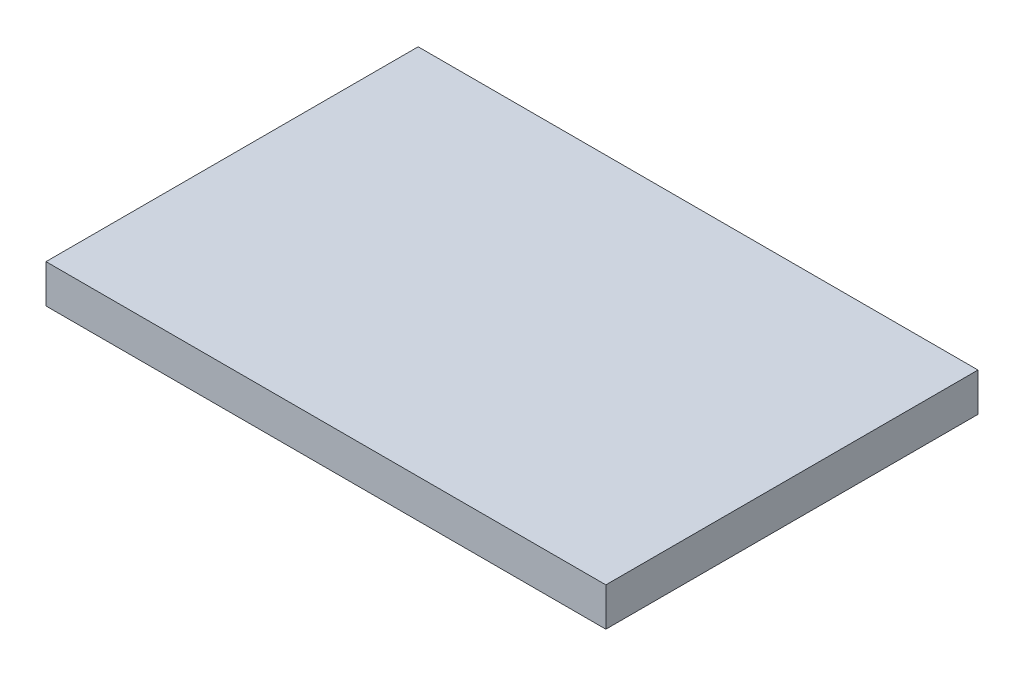
ISO-10303-21;
HEADER;
FILE_DESCRIPTION(('STEP AP214'),'2;1');
FILE_NAME('part.step','',(''),(''),'','','');
FILE_SCHEMA(('AUTOMOTIVE_DESIGN { 1 0 10303 214 1 1 1 1 }'));
ENDSEC;
DATA;
#1=APPLICATION_CONTEXT('core data for automotive mechanical design processes');
#2=APPLICATION_PROTOCOL_DEFINITION('international standard','automotive_design',2000,#1);
#3=PRODUCT_CONTEXT('',#1,'mechanical');
#4=PRODUCT('Part','Part','',(#3));
#5=PRODUCT_RELATED_PRODUCT_CATEGORY('part','',(#4));
#6=PRODUCT_DEFINITION_FORMATION('','',#4);
#7=PRODUCT_DEFINITION_CONTEXT('part definition',#1,'design');
#8=PRODUCT_DEFINITION('design','',#6,#7);
#9=PRODUCT_DEFINITION_SHAPE('','',#8);
#10=(LENGTH_UNIT() NAMED_UNIT(*) SI_UNIT(.MILLI.,.METRE.));
#11=(NAMED_UNIT(*) PLANE_ANGLE_UNIT() SI_UNIT($,.RADIAN.));
#12=(NAMED_UNIT(*) SI_UNIT($,.STERADIAN.) SOLID_ANGLE_UNIT());
#13=UNCERTAINTY_MEASURE_WITH_UNIT(LENGTH_MEASURE(1.E-05),#10,'distance_accuracy_value','');
#14=(GEOMETRIC_REPRESENTATION_CONTEXT(3) GLOBAL_UNCERTAINTY_ASSIGNED_CONTEXT((#13)) GLOBAL_UNIT_ASSIGNED_CONTEXT((#10,
#11,#12)) REPRESENTATION_CONTEXT('',''));
#15=CARTESIAN_POINT('',(0.,0.,0.));
#16=DIRECTION('',(0.,0.,1.));
#17=DIRECTION('',(1.,0.,0.));
#18=AXIS2_PLACEMENT_3D('',#15,#16,#17);
#19=CARTESIAN_POINT('',(-25.5,3.5,16.95));
#20=DIRECTION('',(1.,0.,0.));
#21=DIRECTION('',(0.,0.,-1.));
#22=AXIS2_PLACEMENT_3D('',#19,#20,#21);
#23=PLANE('',#22);
#24=DIRECTION('',(0.,0.,1.));
#25=VECTOR('',#24,1.);
#26=CARTESIAN_POINT('',(-25.5,0.,16.95));
#27=LINE('',#26,#25);
#28=CARTESIAN_POINT('',(-25.5,0.,-16.95));
#29=VERTEX_POINT('',#28);
#30=CARTESIAN_POINT('',(-25.5,0.,16.95));
#31=VERTEX_POINT('',#30);
#32=EDGE_CURVE('E102',#29,#31,#27,.T.);
#33=ORIENTED_EDGE('',*,*,#32,.T.);
#34=DIRECTION('',(0.,-1.,0.));
#35=VECTOR('',#34,1.);
#36=CARTESIAN_POINT('',(-25.5,3.5,16.95));
#37=LINE('',#36,#35);
#38=CARTESIAN_POINT('',(-25.5,3.5,16.95));
#39=VERTEX_POINT('',#38);
#40=EDGE_CURVE('E11',#39,#31,#37,.T.);
#41=ORIENTED_EDGE('',*,*,#40,.F.);
#42=DIRECTION('',(0.,0.,1.));
#43=VECTOR('',#42,1.);
#44=CARTESIAN_POINT('',(-25.5,3.5,16.95));
#45=LINE('',#44,#43);
#46=CARTESIAN_POINT('',(-25.5,3.5,-16.95));
#47=VERTEX_POINT('',#46);
#48=EDGE_CURVE('E90',#47,#39,#45,.T.);
#49=ORIENTED_EDGE('',*,*,#48,.F.);
#50=DIRECTION('',(0.,-1.,0.));
#51=VECTOR('',#50,1.);
#52=CARTESIAN_POINT('',(-25.5,3.5,-16.95));
#53=LINE('',#52,#51);
#54=EDGE_CURVE('E98',#47,#29,#53,.T.);
#55=ORIENTED_EDGE('',*,*,#54,.T.);
#56=EDGE_LOOP('',(#33,#41,#49,#55));
#57=FACE_BOUND('',#56,.T.);
#58=ADVANCED_FACE('F39',(#57),#23,.F.);
#59=CARTESIAN_POINT('',(-25.5,3.5,16.95));
#60=DIRECTION('',(0.,0.,-1.));
#61=DIRECTION('',(-1.,0.,0.));
#62=AXIS2_PLACEMENT_3D('',#59,#60,#61);
#63=PLANE('',#62);
#64=DIRECTION('',(1.,0.,0.));
#65=VECTOR('',#64,1.);
#66=CARTESIAN_POINT('',(-25.5,0.,16.95));
#67=LINE('',#66,#65);
#68=CARTESIAN_POINT('',(25.5,0.,16.95));
#69=VERTEX_POINT('',#68);
#70=EDGE_CURVE('E94',#31,#69,#67,.T.);
#71=ORIENTED_EDGE('',*,*,#70,.T.);
#72=DIRECTION('',(0.,-1.,0.));
#73=VECTOR('',#72,1.);
#74=CARTESIAN_POINT('',(25.5,3.5,16.95));
#75=LINE('',#74,#73);
#76=CARTESIAN_POINT('',(25.5,3.5,16.95));
#77=VERTEX_POINT('',#76);
#78=EDGE_CURVE('E47',#77,#69,#75,.T.);
#79=ORIENTED_EDGE('',*,*,#78,.F.);
#80=DIRECTION('',(1.,0.,0.));
#81=VECTOR('',#80,1.);
#82=CARTESIAN_POINT('',(-25.5,3.5,16.95));
#83=LINE('',#82,#81);
#84=EDGE_CURVE('E85',#39,#77,#83,.T.);
#85=ORIENTED_EDGE('',*,*,#84,.F.);
#86=ORIENTED_EDGE('',*,*,#40,.T.);
#87=EDGE_LOOP('',(#71,#79,#85,#86));
#88=FACE_BOUND('',#87,.T.);
#89=ADVANCED_FACE('F93',(#88),#63,.F.);
#90=CARTESIAN_POINT('',(25.5,3.5,16.95));
#91=DIRECTION('',(-1.,0.,0.));
#92=DIRECTION('',(0.,0.,1.));
#93=AXIS2_PLACEMENT_3D('',#90,#91,#92);
#94=PLANE('',#93);
#95=DIRECTION('',(0.,0.,-1.));
#96=VECTOR('',#95,1.);
#97=CARTESIAN_POINT('',(25.5,0.,16.95));
#98=LINE('',#97,#96);
#99=CARTESIAN_POINT('',(25.5,0.,-16.95));
#100=VERTEX_POINT('',#99);
#101=EDGE_CURVE('E72',#69,#100,#98,.T.);
#102=ORIENTED_EDGE('',*,*,#101,.T.);
#103=DIRECTION('',(0.,-1.,0.));
#104=VECTOR('',#103,1.);
#105=CARTESIAN_POINT('',(25.5,3.5,-16.95));
#106=LINE('',#105,#104);
#107=CARTESIAN_POINT('',(25.5,3.5,-16.95));
#108=VERTEX_POINT('',#107);
#109=EDGE_CURVE('E95',#108,#100,#106,.T.);
#110=ORIENTED_EDGE('',*,*,#109,.F.);
#111=DIRECTION('',(0.,0.,-1.));
#112=VECTOR('',#111,1.);
#113=CARTESIAN_POINT('',(25.5,3.5,16.95));
#114=LINE('',#113,#112);
#115=EDGE_CURVE('E88',#77,#108,#114,.T.);
#116=ORIENTED_EDGE('',*,*,#115,.F.);
#117=ORIENTED_EDGE('',*,*,#78,.T.);
#118=EDGE_LOOP('',(#102,#110,#116,#117));
#119=FACE_BOUND('',#118,.T.);
#120=ADVANCED_FACE('F96',(#119),#94,.F.);
#121=CARTESIAN_POINT('',(-25.5,3.5,-16.95));
#122=DIRECTION('',(0.,0.,1.));
#123=DIRECTION('',(1.,0.,0.));
#124=AXIS2_PLACEMENT_3D('',#121,#122,#123);
#125=PLANE('',#124);
#126=DIRECTION('',(-1.,0.,0.));
#127=VECTOR('',#126,1.);
#128=CARTESIAN_POINT('',(-25.5,0.,-16.95));
#129=LINE('',#128,#127);
#130=EDGE_CURVE('E78',#100,#29,#129,.T.);
#131=ORIENTED_EDGE('',*,*,#130,.T.);
#132=ORIENTED_EDGE('',*,*,#54,.F.);
#133=DIRECTION('',(-1.,0.,0.));
#134=VECTOR('',#133,1.);
#135=CARTESIAN_POINT('',(-25.5,3.5,-16.95));
#136=LINE('',#135,#134);
#137=EDGE_CURVE('E55',#108,#47,#136,.T.);
#138=ORIENTED_EDGE('',*,*,#137,.F.);
#139=ORIENTED_EDGE('',*,*,#109,.T.);
#140=EDGE_LOOP('',(#131,#132,#138,#139));
#141=FACE_BOUND('',#140,.T.);
#142=ADVANCED_FACE('F109',(#141),#125,.F.);
#143=CARTESIAN_POINT('',(0.,3.5,0.));
#144=DIRECTION('',(0.,-1.,0.));
#145=DIRECTION('',(0.,0.,-1.));
#146=AXIS2_PLACEMENT_3D('',#143,#144,#145);
#147=PLANE('',#146);
#148=ORIENTED_EDGE('',*,*,#48,.T.);
#149=ORIENTED_EDGE('',*,*,#84,.T.);
#150=ORIENTED_EDGE('',*,*,#115,.T.);
#151=ORIENTED_EDGE('',*,*,#137,.T.);
#152=EDGE_LOOP('',(#148,#149,#150,#151));
#153=FACE_BOUND('',#152,.T.);
#154=ADVANCED_FACE('F86',(#153),#147,.F.);
#155=CARTESIAN_POINT('',(0.,0.,0.));
#156=DIRECTION('',(0.,-1.,0.));
#157=DIRECTION('',(0.,0.,-1.));
#158=AXIS2_PLACEMENT_3D('',#155,#156,#157);
#159=PLANE('',#158);
#160=ORIENTED_EDGE('',*,*,#32,.F.);
#161=ORIENTED_EDGE('',*,*,#130,.F.);
#162=ORIENTED_EDGE('',*,*,#101,.F.);
#163=ORIENTED_EDGE('',*,*,#70,.F.);
#164=EDGE_LOOP('',(#160,#161,#162,#163));
#165=FACE_BOUND('',#164,.T.);
#166=ADVANCED_FACE('F112',(#165),#159,.T.);
#167=CLOSED_SHELL('',(#58,#89,#120,#142,#154,#166));
#168=MANIFOLD_SOLID_BREP('B2',#167);
#169=ADVANCED_BREP_SHAPE_REPRESENTATION('',(#18,#168),#14);
#170=SHAPE_DEFINITION_REPRESENTATION(#9,#169);
ENDSEC;
END-ISO-10303-21;
